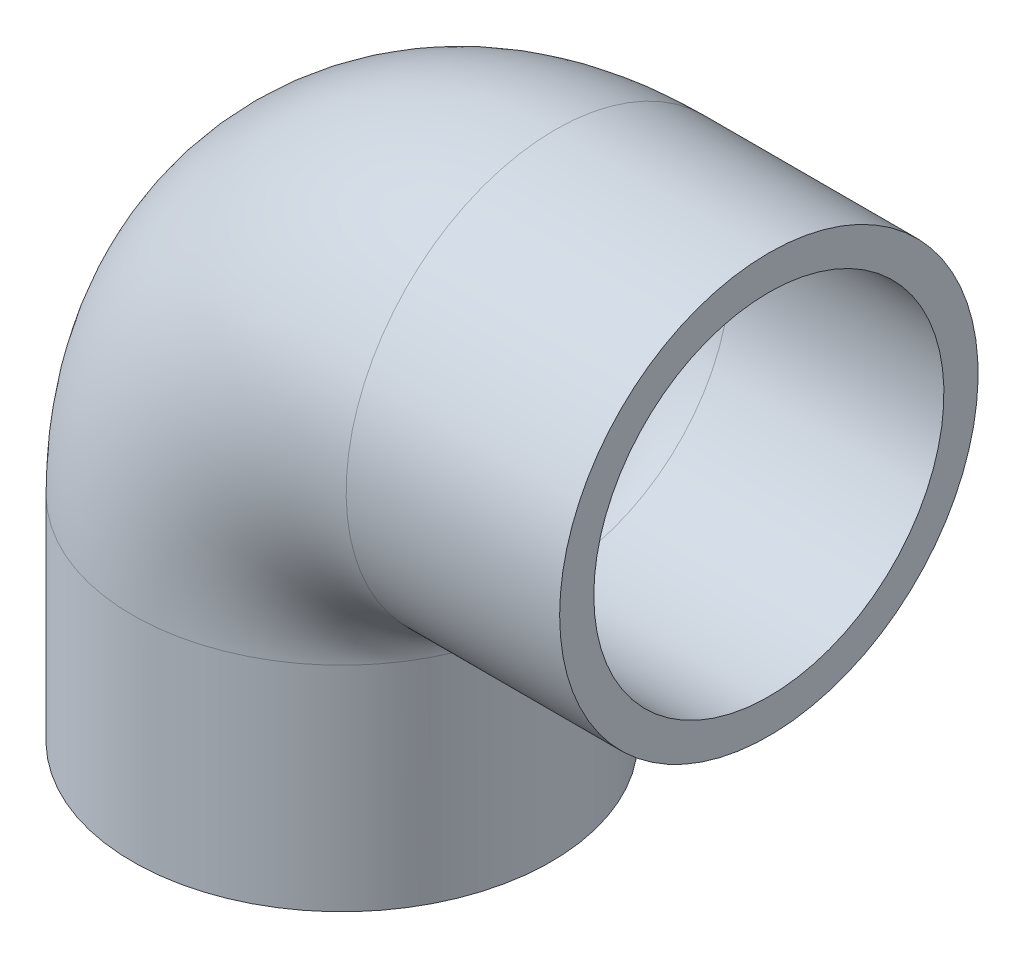
ISO-10303-21;
HEADER;
FILE_DESCRIPTION(('STEP AP214'),'2;1');
FILE_NAME('part.step','',(''),(''),'','','');
FILE_SCHEMA(('AUTOMOTIVE_DESIGN { 1 0 10303 214 1 1 1 1 }'));
ENDSEC;
DATA;
#1=APPLICATION_CONTEXT('core data for automotive mechanical design processes');
#2=APPLICATION_PROTOCOL_DEFINITION('international standard','automotive_design',2000,#1);
#3=PRODUCT_CONTEXT('',#1,'mechanical');
#4=PRODUCT('Part','Part','',(#3));
#5=PRODUCT_RELATED_PRODUCT_CATEGORY('part','',(#4));
#6=PRODUCT_DEFINITION_FORMATION('','',#4);
#7=PRODUCT_DEFINITION_CONTEXT('part definition',#1,'design');
#8=PRODUCT_DEFINITION('design','',#6,#7);
#9=PRODUCT_DEFINITION_SHAPE('','',#8);
#10=(LENGTH_UNIT() NAMED_UNIT(*) SI_UNIT(.MILLI.,.METRE.));
#11=(NAMED_UNIT(*) PLANE_ANGLE_UNIT() SI_UNIT($,.RADIAN.));
#12=(NAMED_UNIT(*) SI_UNIT($,.STERADIAN.) SOLID_ANGLE_UNIT());
#13=UNCERTAINTY_MEASURE_WITH_UNIT(LENGTH_MEASURE(1.E-05),#10,'distance_accuracy_value','');
#14=(GEOMETRIC_REPRESENTATION_CONTEXT(3) GLOBAL_UNCERTAINTY_ASSIGNED_CONTEXT((#13)) GLOBAL_UNIT_ASSIGNED_CONTEXT((#10,
#11,#12)) REPRESENTATION_CONTEXT('',''));
#15=CARTESIAN_POINT('',(0.,0.,0.));
#16=DIRECTION('',(0.,0.,1.));
#17=DIRECTION('',(1.,0.,0.));
#18=AXIS2_PLACEMENT_3D('',#15,#16,#17);
#19=CARTESIAN_POINT('',(-25.308125816062,-7.09748177867422,0.));
#20=DIRECTION('',(0.,-1.,0.));
#21=DIRECTION('',(0.,0.,1.));
#22=AXIS2_PLACEMENT_3D('',#19,#20,#21);
#23=PLANE('',#22);
#24=CARTESIAN_POINT('',(-25.308125816062,-7.09748177867422,0.));
#25=DIRECTION('',(0.,-1.,0.));
#26=DIRECTION('',(0.,0.,1.));
#27=AXIS2_PLACEMENT_3D('',#24,#25,#26);
#28=CIRCLE('',#27,8.2);
#29=CARTESIAN_POINT('',(-25.308125816062,-7.09748177867422,8.2));
#30=VERTEX_POINT('',#29);
#31=EDGE_CURVE('E89',#30,#30,#28,.T.);
#32=ORIENTED_EDGE('',*,*,#31,.F.);
#33=EDGE_LOOP('',(#32));
#34=FACE_BOUND('',#33,.T.);
#35=CARTESIAN_POINT('',(-25.308125816062,-7.09748177867422,0.));
#36=DIRECTION('',(0.,-1.,0.));
#37=DIRECTION('',(0.,0.,-1.));
#38=AXIS2_PLACEMENT_3D('',#35,#36,#37);
#39=CIRCLE('',#38,9.8);
#40=CARTESIAN_POINT('',(-25.308125816062,-7.09748177867422,-9.8));
#41=VERTEX_POINT('',#40);
#42=EDGE_CURVE('E68',#41,#41,#39,.T.);
#43=ORIENTED_EDGE('',*,*,#42,.T.);
#44=EDGE_LOOP('',(#43));
#45=FACE_BOUND('',#44,.T.);
#46=ADVANCED_FACE('F49',(#34,#45),#23,.T.);
#47=CARTESIAN_POINT('',(-5.30812581606204,12.9025182213258,0.));
#48=DIRECTION('',(-1.,0.,0.));
#49=DIRECTION('',(0.,0.,1.));
#50=AXIS2_PLACEMENT_3D('',#47,#48,#49);
#51=PLANE('',#50);
#52=CARTESIAN_POINT('',(-5.30812581606204,12.9025182213258,0.));
#53=DIRECTION('',(-1.,0.,0.));
#54=DIRECTION('',(0.,0.,1.));
#55=AXIS2_PLACEMENT_3D('',#52,#53,#54);
#56=CIRCLE('',#55,8.2);
#57=CARTESIAN_POINT('',(-5.30812581606204,12.9025182213258,8.2));
#58=VERTEX_POINT('',#57);
#59=EDGE_CURVE('E73',#58,#58,#56,.T.);
#60=ORIENTED_EDGE('',*,*,#59,.T.);
#61=EDGE_LOOP('',(#60));
#62=FACE_BOUND('',#61,.T.);
#63=CARTESIAN_POINT('',(-5.30812581606204,12.9025182213258,0.));
#64=DIRECTION('',(-1.,0.,0.));
#65=DIRECTION('',(0.,0.,1.));
#66=AXIS2_PLACEMENT_3D('',#63,#64,#65);
#67=CIRCLE('',#66,9.8);
#68=CARTESIAN_POINT('',(-5.30812581606204,12.9025182213258,9.8));
#69=VERTEX_POINT('',#68);
#70=EDGE_CURVE('E11',#69,#69,#67,.T.);
#71=ORIENTED_EDGE('',*,*,#70,.F.);
#72=EDGE_LOOP('',(#71));
#73=FACE_BOUND('',#72,.T.);
#74=ADVANCED_FACE('F97',(#62,#73),#51,.F.);
#75=CARTESIAN_POINT('',(-25.308125816062,-7.09748177867422,0.));
#76=DIRECTION('',(0.,1.,0.));
#77=DIRECTION('',(0.,0.,1.));
#78=AXIS2_PLACEMENT_3D('',#75,#76,#77);
#79=CYLINDRICAL_SURFACE('',#78,9.8);
#80=CARTESIAN_POINT('',(-25.308125816062,2.9025182213257,0.));
#81=DIRECTION('',(0.,1.,0.));
#82=DIRECTION('',(0.,0.,1.));
#83=AXIS2_PLACEMENT_3D('',#80,#81,#82);
#84=CIRCLE('',#83,9.8);
#85=CARTESIAN_POINT('',(-35.108125816062,2.90251822132563,0.));
#86=VERTEX_POINT('',#85);
#87=EDGE_CURVE('E62',#86,#86,#84,.F.);
#88=ORIENTED_EDGE('',*,*,#87,.T.);
#89=EDGE_LOOP('',(#88));
#90=FACE_BOUND('',#89,.T.);
#91=ORIENTED_EDGE('',*,*,#42,.F.);
#92=EDGE_LOOP('',(#91));
#93=FACE_BOUND('',#92,.T.);
#94=ADVANCED_FACE('F103',(#90,#93),#79,.T.);
#95=CARTESIAN_POINT('',(-15.308125816062,2.90251822132578,0.));
#96=DIRECTION('',(0.,0.,-1.));
#97=DIRECTION('',(-1.,0.,0.));
#98=AXIS2_PLACEMENT_3D('',#95,#96,#97);
#99=TOROIDAL_SURFACE('',#98,10.,9.8);
#100=CARTESIAN_POINT('',(-15.3081258160621,12.9025182213258,0.));
#101=DIRECTION('',(-1.,0.,0.));
#102=DIRECTION('',(0.,-1.,0.));
#103=AXIS2_PLACEMENT_3D('',#100,#101,#102);
#104=CIRCLE('',#103,9.8);
#105=CARTESIAN_POINT('',(-15.3081258160621,22.7025182213258,0.));
#106=VERTEX_POINT('',#105);
#107=EDGE_CURVE('E57',#106,#106,#104,.T.);
#108=CARTESIAN_POINT('',(-15.308125816062,2.90251822132578,0.));
#109=DIRECTION('',(0.,0.,-1.));
#110=DIRECTION('',(-1.,0.,0.));
#111=AXIS2_PLACEMENT_3D('',#108,#109,#110);
#112=CIRCLE('',#111,19.8);
#113=EDGE_CURVE('',#86,#106,#112,.T.);
#114=ORIENTED_EDGE('',*,*,#87,.F.);
#115=ORIENTED_EDGE('',*,*,#107,.T.);
#116=ORIENTED_EDGE('',*,*,#113,.T.);
#117=ORIENTED_EDGE('',*,*,#113,.F.);
#118=EDGE_LOOP('',(#114,#116,#115,#117));
#119=FACE_BOUND('',#118,.T.);
#120=ADVANCED_FACE('F111',(#119),#99,.T.);
#121=CARTESIAN_POINT('',(-15.308125816062,12.9025182213258,0.));
#122=DIRECTION('',(1.,0.,0.));
#123=DIRECTION('',(0.,0.,-1.));
#124=AXIS2_PLACEMENT_3D('',#121,#122,#123);
#125=CYLINDRICAL_SURFACE('',#124,9.8);
#126=ORIENTED_EDGE('',*,*,#70,.T.);
#127=EDGE_LOOP('',(#126));
#128=FACE_BOUND('',#127,.T.);
#129=ORIENTED_EDGE('',*,*,#107,.F.);
#130=EDGE_LOOP('',(#129));
#131=FACE_BOUND('',#130,.T.);
#132=ADVANCED_FACE('F51',(#128,#131),#125,.T.);
#133=CARTESIAN_POINT('',(-25.308125816062,-7.09748177867422,0.));
#134=DIRECTION('',(0.,1.,0.));
#135=DIRECTION('',(0.,0.,1.));
#136=AXIS2_PLACEMENT_3D('',#133,#134,#135);
#137=CYLINDRICAL_SURFACE('',#136,8.2);
#138=CARTESIAN_POINT('',(-25.308125816062,2.9025182213257,0.));
#139=DIRECTION('',(0.,-1.,0.));
#140=DIRECTION('',(0.,0.,1.));
#141=AXIS2_PLACEMENT_3D('',#138,#139,#140);
#142=CIRCLE('',#141,8.2);
#143=CARTESIAN_POINT('',(-33.508125816062,2.90251822132564,0.));
#144=VERTEX_POINT('',#143);
#145=EDGE_CURVE('E83',#144,#144,#142,.T.);
#146=ORIENTED_EDGE('',*,*,#145,.F.);
#147=EDGE_LOOP('',(#146));
#148=FACE_BOUND('',#147,.T.);
#149=ORIENTED_EDGE('',*,*,#31,.T.);
#150=EDGE_LOOP('',(#149));
#151=FACE_BOUND('',#150,.T.);
#152=ADVANCED_FACE('F94',(#148,#151),#137,.F.);
#153=CARTESIAN_POINT('',(-15.308125816062,2.90251822132578,0.));
#154=DIRECTION('',(0.,0.,-1.));
#155=DIRECTION('',(-1.,0.,0.));
#156=AXIS2_PLACEMENT_3D('',#153,#154,#155);
#157=TOROIDAL_SURFACE('',#156,10.,8.2);
#158=CARTESIAN_POINT('',(-15.3081258160621,12.9025182213257,0.));
#159=DIRECTION('',(-1.,0.,0.));
#160=DIRECTION('',(0.,0.,1.));
#161=AXIS2_PLACEMENT_3D('',#158,#159,#160);
#162=CIRCLE('',#161,8.2);
#163=CARTESIAN_POINT('',(-15.3081258160621,21.1025182213258,0.));
#164=VERTEX_POINT('',#163);
#165=EDGE_CURVE('E78',#164,#164,#162,.T.);
#166=CARTESIAN_POINT('',(-15.308125816062,2.90251822132578,0.));
#167=DIRECTION('',(0.,0.,-1.));
#168=DIRECTION('',(-1.,0.,0.));
#169=AXIS2_PLACEMENT_3D('',#166,#167,#168);
#170=CIRCLE('',#169,18.2);
#171=EDGE_CURVE('',#144,#164,#170,.T.);
#172=ORIENTED_EDGE('',*,*,#145,.T.);
#173=ORIENTED_EDGE('',*,*,#165,.F.);
#174=ORIENTED_EDGE('',*,*,#171,.T.);
#175=ORIENTED_EDGE('',*,*,#171,.F.);
#176=EDGE_LOOP('',(#172,#174,#173,#175));
#177=FACE_BOUND('',#176,.T.);
#178=ADVANCED_FACE('F107',(#177),#157,.F.);
#179=CARTESIAN_POINT('',(-15.308125816062,12.9025182213258,0.));
#180=DIRECTION('',(1.,0.,0.));
#181=DIRECTION('',(0.,0.,-1.));
#182=AXIS2_PLACEMENT_3D('',#179,#180,#181);
#183=CYLINDRICAL_SURFACE('',#182,8.2);
#184=ORIENTED_EDGE('',*,*,#59,.F.);
#185=EDGE_LOOP('',(#184));
#186=FACE_BOUND('',#185,.T.);
#187=ORIENTED_EDGE('',*,*,#165,.T.);
#188=EDGE_LOOP('',(#187));
#189=FACE_BOUND('',#188,.T.);
#190=ADVANCED_FACE('F99',(#186,#189),#183,.F.);
#191=CLOSED_SHELL('',(#46,#74,#94,#120,#132,#152,#178,#190));
#192=MANIFOLD_SOLID_BREP('B2',#191);
#193=ADVANCED_BREP_SHAPE_REPRESENTATION('',(#18,#192),#14);
#194=SHAPE_DEFINITION_REPRESENTATION(#9,#193);
ENDSEC;
END-ISO-10303-21;
